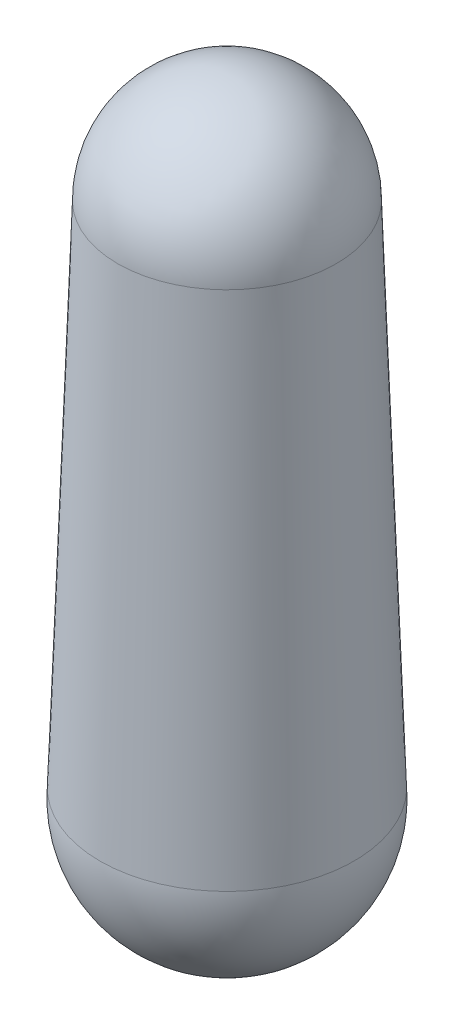
ISO-10303-21;
HEADER;
FILE_DESCRIPTION(('STEP AP214'),'2;1');
FILE_NAME('part.step','',(''),(''),'','','');
FILE_SCHEMA(('AUTOMOTIVE_DESIGN { 1 0 10303 214 1 1 1 1 }'));
ENDSEC;
DATA;
#1=APPLICATION_CONTEXT('core data for automotive mechanical design processes');
#2=APPLICATION_PROTOCOL_DEFINITION('international standard','automotive_design',2000,#1);
#3=PRODUCT_CONTEXT('',#1,'mechanical');
#4=PRODUCT('Part','Part','',(#3));
#5=PRODUCT_RELATED_PRODUCT_CATEGORY('part','',(#4));
#6=PRODUCT_DEFINITION_FORMATION('','',#4);
#7=PRODUCT_DEFINITION_CONTEXT('part definition',#1,'design');
#8=PRODUCT_DEFINITION('design','',#6,#7);
#9=PRODUCT_DEFINITION_SHAPE('','',#8);
#10=(LENGTH_UNIT() NAMED_UNIT(*) SI_UNIT(.MILLI.,.METRE.));
#11=(NAMED_UNIT(*) PLANE_ANGLE_UNIT() SI_UNIT($,.RADIAN.));
#12=(NAMED_UNIT(*) SI_UNIT($,.STERADIAN.) SOLID_ANGLE_UNIT());
#13=UNCERTAINTY_MEASURE_WITH_UNIT(LENGTH_MEASURE(1.E-05),#10,'distance_accuracy_value','');
#14=(GEOMETRIC_REPRESENTATION_CONTEXT(3) GLOBAL_UNCERTAINTY_ASSIGNED_CONTEXT((#13)) GLOBAL_UNIT_ASSIGNED_CONTEXT((#10,
#11,#12)) REPRESENTATION_CONTEXT('',''));
#15=CARTESIAN_POINT('',(0.,0.,0.));
#16=DIRECTION('',(0.,0.,1.));
#17=DIRECTION('',(1.,0.,0.));
#18=AXIS2_PLACEMENT_3D('',#15,#16,#17);
#19=CARTESIAN_POINT('',(0.,0.,0.));
#20=DIRECTION('',(0.,0.,-1.));
#21=DIRECTION('',(1.,0.,0.));
#22=AXIS2_PLACEMENT_3D('',#19,#20,#21);
#23=SPHERICAL_SURFACE('',#22,1.97);
#24=CARTESIAN_POINT('',(0.,0.,0.));
#25=DIRECTION('',(0.,-1.,0.));
#26=DIRECTION('',(0.,0.,-1.));
#27=AXIS2_PLACEMENT_3D('',#24,#25,#26);
#28=SPHERICAL_SURFACE('',#27,1.97);
#29=CARTESIAN_POINT('',(0.,0.137420253276064,0.));
#30=DIRECTION('',(0.,-1.,0.));
#31=DIRECTION('',(0.,0.,-1.));
#32=AXIS2_PLACEMENT_3D('',#29,#30,#31);
#33=CIRCLE('',#32,1.96520117901185);
#34=CARTESIAN_POINT('',(0.,0.137420253276064,-1.96520117901185));
#35=VERTEX_POINT('',#34);
#36=EDGE_CURVE('E10',#35,#35,#33,.F.);
#37=ORIENTED_EDGE('',*,*,#36,.F.);
#38=EDGE_LOOP('',(#37));
#39=FACE_BOUND('',#38,.T.);
#40=ADVANCED_FACE('F32',(#39),#28,.T.);
#41=CARTESIAN_POINT('',(0.,0.,0.));
#42=DIRECTION('',(0.,-1.,0.));
#43=DIRECTION('',(0.,0.,1.));
#44=AXIS2_PLACEMENT_3D('',#41,#42,#43);
#45=CONICAL_SURFACE('',#44,1.97,0.0349065850398866);
#46=CARTESIAN_POINT('',(0.,8.,0.));
#47=DIRECTION('',(0.,1.,0.));
#48=DIRECTION('',(0.,0.,1.));
#49=AXIS2_PLACEMENT_3D('',#46,#47,#48);
#50=CIRCLE('',#49,1.69063384406602);
#51=CARTESIAN_POINT('',(0.,8.,1.69063384406602));
#52=VERTEX_POINT('',#51);
#53=EDGE_CURVE('E38',#52,#52,#50,.T.);
#54=ORIENTED_EDGE('',*,*,#53,.F.);
#55=EDGE_LOOP('',(#54));
#56=FACE_BOUND('',#55,.T.);
#57=ORIENTED_EDGE('',*,*,#36,.T.);
#58=EDGE_LOOP('',(#57));
#59=FACE_BOUND('',#58,.T.);
#60=ADVANCED_FACE('F46',(#56,#59),#45,.T.);
#61=CARTESIAN_POINT('',(0.,8.,0.));
#62=DIRECTION('',(0.,0.,-1.));
#63=DIRECTION('',(1.,0.,0.));
#64=AXIS2_PLACEMENT_3D('',#61,#62,#63);
#65=SPHERICAL_SURFACE('',#64,1.69063384406602);
#66=CARTESIAN_POINT('',(0.,8.,0.));
#67=DIRECTION('',(0.,1.,0.));
#68=DIRECTION('',(0.,0.,1.));
#69=AXIS2_PLACEMENT_3D('',#66,#67,#68);
#70=SPHERICAL_SURFACE('',#69,1.69063384406602);
#71=ORIENTED_EDGE('',*,*,#53,.T.);
#72=EDGE_LOOP('',(#71));
#73=FACE_BOUND('',#72,.T.);
#74=ADVANCED_FACE('F44',(#73),#70,.T.);
#75=CLOSED_SHELL('',(#40,#60,#74));
#76=MANIFOLD_SOLID_BREP('B2',#75);
#77=ADVANCED_BREP_SHAPE_REPRESENTATION('',(#18,#76),#14);
#78=SHAPE_DEFINITION_REPRESENTATION(#9,#77);
ENDSEC;
END-ISO-10303-21;
